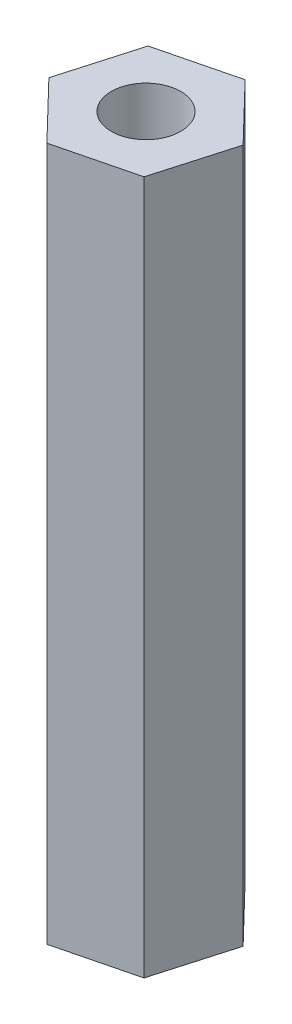
ISO-10303-21;
HEADER;
FILE_DESCRIPTION(('STEP AP214'),'2;1');
FILE_NAME('part.step','',(''),(''),'','','');
FILE_SCHEMA(('AUTOMOTIVE_DESIGN { 1 0 10303 214 1 1 1 1 }'));
ENDSEC;
DATA;
#1=APPLICATION_CONTEXT('core data for automotive mechanical design processes');
#2=APPLICATION_PROTOCOL_DEFINITION('international standard','automotive_design',2000,#1);
#3=PRODUCT_CONTEXT('',#1,'mechanical');
#4=PRODUCT('Part','Part','',(#3));
#5=PRODUCT_RELATED_PRODUCT_CATEGORY('part','',(#4));
#6=PRODUCT_DEFINITION_FORMATION('','',#4);
#7=PRODUCT_DEFINITION_CONTEXT('part definition',#1,'design');
#8=PRODUCT_DEFINITION('design','',#6,#7);
#9=PRODUCT_DEFINITION_SHAPE('','',#8);
#10=(LENGTH_UNIT() NAMED_UNIT(*) SI_UNIT(.MILLI.,.METRE.));
#11=(NAMED_UNIT(*) PLANE_ANGLE_UNIT() SI_UNIT($,.RADIAN.));
#12=(NAMED_UNIT(*) SI_UNIT($,.STERADIAN.) SOLID_ANGLE_UNIT());
#13=UNCERTAINTY_MEASURE_WITH_UNIT(LENGTH_MEASURE(1.E-05),#10,'distance_accuracy_value','');
#14=(GEOMETRIC_REPRESENTATION_CONTEXT(3) GLOBAL_UNCERTAINTY_ASSIGNED_CONTEXT((#13)) GLOBAL_UNIT_ASSIGNED_CONTEXT((#10,
#11,#12)) REPRESENTATION_CONTEXT('',''));
#15=CARTESIAN_POINT('',(0.,0.,0.));
#16=DIRECTION('',(0.,0.,1.));
#17=DIRECTION('',(1.,0.,0.));
#18=AXIS2_PLACEMENT_3D('',#15,#16,#17);
#19=CARTESIAN_POINT('',(-0.955131393465946,30.,3.32982342192733));
#20=DIRECTION('',(-0.241835763884429,0.,-0.970317197264088));
#21=DIRECTION('',(-0.970317197264088,0.,0.241835763884429));
#22=AXIS2_PLACEMENT_3D('',#19,#20,#21);
#23=PLANE('',#22);
#24=DIRECTION('',(0.970317197264088,0.,-0.241835763884429));
#25=VECTOR('',#24,1.);
#26=CARTESIAN_POINT('',(-0.955131393465946,0.,3.32982342192733));
#27=LINE('',#26,#25);
#28=CARTESIAN_POINT('',(-0.955131393465946,0.,3.32982342192733));
#29=VERTEX_POINT('',#28);
#30=CARTESIAN_POINT('',(2.40614597677252,0.,2.4920797616572));
#31=VERTEX_POINT('',#30);
#32=EDGE_CURVE('E119',#29,#31,#27,.T.);
#33=ORIENTED_EDGE('',*,*,#32,.T.);
#34=DIRECTION('',(0.,-1.,0.));
#35=VECTOR('',#34,1.);
#36=CARTESIAN_POINT('',(2.40614597677252,30.,2.4920797616572));
#37=LINE('',#36,#35);
#38=CARTESIAN_POINT('',(2.40614597677252,30.,2.4920797616572));
#39=VERTEX_POINT('',#38);
#40=EDGE_CURVE('E11',#39,#31,#37,.T.);
#41=ORIENTED_EDGE('',*,*,#40,.F.);
#42=DIRECTION('',(0.970317197264088,0.,-0.241835763884429));
#43=VECTOR('',#42,1.);
#44=CARTESIAN_POINT('',(-0.955131393465946,30.,3.32982342192733));
#45=LINE('',#44,#43);
#46=CARTESIAN_POINT('',(-0.955131393465946,30.,3.32982342192733));
#47=VERTEX_POINT('',#46);
#48=EDGE_CURVE('E130',#47,#39,#45,.T.);
#49=ORIENTED_EDGE('',*,*,#48,.F.);
#50=DIRECTION('',(0.,-1.,0.));
#51=VECTOR('',#50,1.);
#52=CARTESIAN_POINT('',(-0.955131393465946,30.,3.32982342192733));
#53=LINE('',#52,#51);
#54=EDGE_CURVE('E115',#47,#29,#53,.T.);
#55=ORIENTED_EDGE('',*,*,#54,.T.);
#56=EDGE_LOOP('',(#33,#41,#49,#55));
#57=FACE_BOUND('',#56,.T.);
#58=ADVANCED_FACE('F35',(#57),#23,.F.);
#59=CARTESIAN_POINT('',(2.40614597677252,30.,2.4920797616572));
#60=DIRECTION('',(-0.961237224501831,0.,-0.275722683564513));
#61=DIRECTION('',(-0.275722683564513,0.,0.961237224501831));
#62=AXIS2_PLACEMENT_3D('',#59,#60,#61);
#63=PLANE('',#62);
#64=DIRECTION('',(0.275722683564513,0.,-0.961237224501831));
#65=VECTOR('',#64,1.);
#66=CARTESIAN_POINT('',(2.40614597677252,0.,2.4920797616572));
#67=LINE('',#66,#65);
#68=CARTESIAN_POINT('',(3.36127737023847,0.,-0.837743660270124));
#69=VERTEX_POINT('',#68);
#70=EDGE_CURVE('E122',#31,#69,#67,.T.);
#71=ORIENTED_EDGE('',*,*,#70,.T.);
#72=DIRECTION('',(0.,-1.,0.));
#73=VECTOR('',#72,1.);
#74=CARTESIAN_POINT('',(3.36127737023847,30.,-0.837743660270124));
#75=LINE('',#74,#73);
#76=CARTESIAN_POINT('',(3.36127737023847,30.,-0.837743660270124));
#77=VERTEX_POINT('',#76);
#78=EDGE_CURVE('E43',#77,#69,#75,.T.);
#79=ORIENTED_EDGE('',*,*,#78,.F.);
#80=DIRECTION('',(0.275722683564513,0.,-0.961237224501831));
#81=VECTOR('',#80,1.);
#82=CARTESIAN_POINT('',(2.40614597677252,30.,2.4920797616572));
#83=LINE('',#82,#81);
#84=EDGE_CURVE('E88',#39,#77,#83,.T.);
#85=ORIENTED_EDGE('',*,*,#84,.F.);
#86=ORIENTED_EDGE('',*,*,#40,.T.);
#87=EDGE_LOOP('',(#71,#79,#85,#86));
#88=FACE_BOUND('',#87,.T.);
#89=ADVANCED_FACE('F155',(#88),#63,.F.);
#90=CARTESIAN_POINT('',(3.36127737023847,30.,-0.837743660270124));
#91=DIRECTION('',(-0.719401460617402,0.,0.694594513699575));
#92=DIRECTION('',(0.694594513699575,0.,0.719401460617402));
#93=AXIS2_PLACEMENT_3D('',#90,#91,#92);
#94=PLANE('',#93);
#95=DIRECTION('',(-0.694594513699575,0.,-0.719401460617402));
#96=VECTOR('',#95,1.);
#97=CARTESIAN_POINT('',(3.36127737023847,0.,-0.837743660270124));
#98=LINE('',#97,#96);
#99=CARTESIAN_POINT('',(0.955131393465946,0.,-3.32982342192733));
#100=VERTEX_POINT('',#99);
#101=EDGE_CURVE('E125',#69,#100,#98,.T.);
#102=ORIENTED_EDGE('',*,*,#101,.T.);
#103=DIRECTION('',(0.,-1.,0.));
#104=VECTOR('',#103,1.);
#105=CARTESIAN_POINT('',(0.955131393465946,30.,-3.32982342192733));
#106=LINE('',#105,#104);
#107=CARTESIAN_POINT('',(0.955131393465946,30.,-3.32982342192733));
#108=VERTEX_POINT('',#107);
#109=EDGE_CURVE('E110',#108,#100,#106,.T.);
#110=ORIENTED_EDGE('',*,*,#109,.F.);
#111=DIRECTION('',(-0.694594513699575,0.,-0.719401460617402));
#112=VECTOR('',#111,1.);
#113=CARTESIAN_POINT('',(3.36127737023847,30.,-0.837743660270124));
#114=LINE('',#113,#112);
#115=EDGE_CURVE('E101',#77,#108,#114,.T.);
#116=ORIENTED_EDGE('',*,*,#115,.F.);
#117=ORIENTED_EDGE('',*,*,#78,.T.);
#118=EDGE_LOOP('',(#102,#110,#116,#117));
#119=FACE_BOUND('',#118,.T.);
#120=ADVANCED_FACE('F136',(#119),#94,.F.);
#121=CARTESIAN_POINT('',(0.955131393465946,30.,-3.32982342192733));
#122=DIRECTION('',(0.241835763884429,0.,0.970317197264088));
#123=DIRECTION('',(0.970317197264088,0.,-0.241835763884429));
#124=AXIS2_PLACEMENT_3D('',#121,#122,#123);
#125=PLANE('',#124);
#126=DIRECTION('',(-0.970317197264088,0.,0.241835763884429));
#127=VECTOR('',#126,1.);
#128=CARTESIAN_POINT('',(0.955131393465946,0.,-3.32982342192733));
#129=LINE('',#128,#127);
#130=CARTESIAN_POINT('',(-2.40614597677252,0.,-2.4920797616572));
#131=VERTEX_POINT('',#130);
#132=EDGE_CURVE('E109',#100,#131,#129,.T.);
#133=ORIENTED_EDGE('',*,*,#132,.T.);
#134=DIRECTION('',(0.,-1.,0.));
#135=VECTOR('',#134,1.);
#136=CARTESIAN_POINT('',(-2.40614597677252,30.,-2.4920797616572));
#137=LINE('',#136,#135);
#138=CARTESIAN_POINT('',(-2.40614597677252,30.,-2.4920797616572));
#139=VERTEX_POINT('',#138);
#140=EDGE_CURVE('E106',#139,#131,#137,.T.);
#141=ORIENTED_EDGE('',*,*,#140,.F.);
#142=DIRECTION('',(-0.970317197264088,0.,0.241835763884429));
#143=VECTOR('',#142,1.);
#144=CARTESIAN_POINT('',(0.955131393465946,30.,-3.32982342192733));
#145=LINE('',#144,#143);
#146=EDGE_CURVE('E95',#108,#139,#145,.T.);
#147=ORIENTED_EDGE('',*,*,#146,.F.);
#148=ORIENTED_EDGE('',*,*,#109,.T.);
#149=EDGE_LOOP('',(#133,#141,#147,#148));
#150=FACE_BOUND('',#149,.T.);
#151=ADVANCED_FACE('F107',(#150),#125,.F.);
#152=CARTESIAN_POINT('',(-2.40614597677252,30.,-2.4920797616572));
#153=DIRECTION('',(0.961237224501831,0.,0.275722683564513));
#154=DIRECTION('',(0.275722683564513,0.,-0.961237224501831));
#155=AXIS2_PLACEMENT_3D('',#152,#153,#154);
#156=PLANE('',#155);
#157=DIRECTION('',(-0.275722683564513,0.,0.961237224501831));
#158=VECTOR('',#157,1.);
#159=CARTESIAN_POINT('',(-2.40614597677252,0.,-2.4920797616572));
#160=LINE('',#159,#158);
#161=CARTESIAN_POINT('',(-3.36127737023847,0.,0.837743660270123));
#162=VERTEX_POINT('',#161);
#163=EDGE_CURVE('E74',#131,#162,#160,.T.);
#164=ORIENTED_EDGE('',*,*,#163,.T.);
#165=DIRECTION('',(0.,-1.,0.));
#166=VECTOR('',#165,1.);
#167=CARTESIAN_POINT('',(-3.36127737023847,30.,0.837743660270123));
#168=LINE('',#167,#166);
#169=CARTESIAN_POINT('',(-3.36127737023847,30.,0.837743660270123));
#170=VERTEX_POINT('',#169);
#171=EDGE_CURVE('E111',#170,#162,#168,.T.);
#172=ORIENTED_EDGE('',*,*,#171,.F.);
#173=DIRECTION('',(-0.275722683564513,0.,0.961237224501831));
#174=VECTOR('',#173,1.);
#175=CARTESIAN_POINT('',(-2.40614597677252,30.,-2.4920797616572));
#176=LINE('',#175,#174);
#177=EDGE_CURVE('E99',#139,#170,#176,.T.);
#178=ORIENTED_EDGE('',*,*,#177,.F.);
#179=ORIENTED_EDGE('',*,*,#140,.T.);
#180=EDGE_LOOP('',(#164,#172,#178,#179));
#181=FACE_BOUND('',#180,.T.);
#182=ADVANCED_FACE('F113',(#181),#156,.F.);
#183=CARTESIAN_POINT('',(-3.36127737023847,30.,0.837743660270123));
#184=DIRECTION('',(0.719401460617402,0.,-0.694594513699575));
#185=DIRECTION('',(-0.694594513699575,0.,-0.719401460617402));
#186=AXIS2_PLACEMENT_3D('',#183,#184,#185);
#187=PLANE('',#186);
#188=DIRECTION('',(0.694594513699575,0.,0.719401460617402));
#189=VECTOR('',#188,1.);
#190=CARTESIAN_POINT('',(-3.36127737023847,0.,0.837743660270123));
#191=LINE('',#190,#189);
#192=EDGE_CURVE('E80',#162,#29,#191,.T.);
#193=ORIENTED_EDGE('',*,*,#192,.T.);
#194=ORIENTED_EDGE('',*,*,#54,.F.);
#195=DIRECTION('',(0.694594513699575,0.,0.719401460617402));
#196=VECTOR('',#195,1.);
#197=CARTESIAN_POINT('',(-3.36127737023847,30.,0.837743660270123));
#198=LINE('',#197,#196);
#199=EDGE_CURVE('E51',#170,#47,#198,.T.);
#200=ORIENTED_EDGE('',*,*,#199,.F.);
#201=ORIENTED_EDGE('',*,*,#171,.T.);
#202=EDGE_LOOP('',(#193,#194,#200,#201));
#203=FACE_BOUND('',#202,.T.);
#204=ADVANCED_FACE('F143',(#203),#187,.F.);
#205=CARTESIAN_POINT('',(0.,30.,0.));
#206=DIRECTION('',(0.,1.,0.));
#207=DIRECTION('',(0.,0.,1.));
#208=AXIS2_PLACEMENT_3D('',#205,#206,#207);
#209=PLANE('',#208);
#210=CARTESIAN_POINT('',(0.,30.,0.));
#211=DIRECTION('',(0.,-1.,0.));
#212=DIRECTION('',(0.,0.,-1.));
#213=AXIS2_PLACEMENT_3D('',#210,#211,#212);
#214=CIRCLE('',#213,1.5);
#215=CARTESIAN_POINT('',(0.,30.,-1.5));
#216=VERTEX_POINT('',#215);
#217=EDGE_CURVE('E123',#216,#216,#214,.T.);
#218=ORIENTED_EDGE('',*,*,#217,.T.);
#219=EDGE_LOOP('',(#218));
#220=FACE_BOUND('',#219,.T.);
#221=ORIENTED_EDGE('',*,*,#48,.T.);
#222=ORIENTED_EDGE('',*,*,#84,.T.);
#223=ORIENTED_EDGE('',*,*,#115,.T.);
#224=ORIENTED_EDGE('',*,*,#146,.T.);
#225=ORIENTED_EDGE('',*,*,#177,.T.);
#226=ORIENTED_EDGE('',*,*,#199,.T.);
#227=EDGE_LOOP('',(#221,#222,#223,#224,#225,#226));
#228=FACE_BOUND('',#227,.T.);
#229=ADVANCED_FACE('F97',(#220,#228),#209,.T.);
#230=CARTESIAN_POINT('',(0.,0.,0.));
#231=DIRECTION('',(0.,1.,0.));
#232=DIRECTION('',(0.,0.,1.));
#233=AXIS2_PLACEMENT_3D('',#230,#231,#232);
#234=PLANE('',#233);
#235=CARTESIAN_POINT('',(0.,0.,0.));
#236=DIRECTION('',(0.,-1.,0.));
#237=DIRECTION('',(0.,0.,-1.));
#238=AXIS2_PLACEMENT_3D('',#235,#236,#237);
#239=CIRCLE('',#238,1.5);
#240=CARTESIAN_POINT('',(0.,0.,-1.5));
#241=VERTEX_POINT('',#240);
#242=EDGE_CURVE('E210',#241,#241,#239,.T.);
#243=ORIENTED_EDGE('',*,*,#242,.F.);
#244=EDGE_LOOP('',(#243));
#245=FACE_BOUND('',#244,.T.);
#246=ORIENTED_EDGE('',*,*,#32,.F.);
#247=ORIENTED_EDGE('',*,*,#192,.F.);
#248=ORIENTED_EDGE('',*,*,#163,.F.);
#249=ORIENTED_EDGE('',*,*,#132,.F.);
#250=ORIENTED_EDGE('',*,*,#101,.F.);
#251=ORIENTED_EDGE('',*,*,#70,.F.);
#252=EDGE_LOOP('',(#246,#247,#248,#249,#250,#251));
#253=FACE_BOUND('',#252,.T.);
#254=ADVANCED_FACE('F139',(#245,#253),#234,.F.);
#255=CARTESIAN_POINT('',(0.,30.,0.));
#256=DIRECTION('',(0.,-1.,0.));
#257=DIRECTION('',(0.,0.,-1.));
#258=AXIS2_PLACEMENT_3D('',#255,#256,#257);
#259=CYLINDRICAL_SURFACE('',#258,1.5);
#260=ORIENTED_EDGE('',*,*,#217,.F.);
#261=EDGE_LOOP('',(#260));
#262=FACE_BOUND('',#261,.T.);
#263=ORIENTED_EDGE('',*,*,#242,.T.);
#264=EDGE_LOOP('',(#263));
#265=FACE_BOUND('',#264,.T.);
#266=ADVANCED_FACE('F192',(#262,#265),#259,.F.);
#267=CLOSED_SHELL('',(#58,#89,#120,#151,#182,#204,#229,#254,#266));
#268=MANIFOLD_SOLID_BREP('B2',#267);
#269=ADVANCED_BREP_SHAPE_REPRESENTATION('',(#18,#268),#14);
#270=SHAPE_DEFINITION_REPRESENTATION(#9,#269);
ENDSEC;
END-ISO-10303-21;
